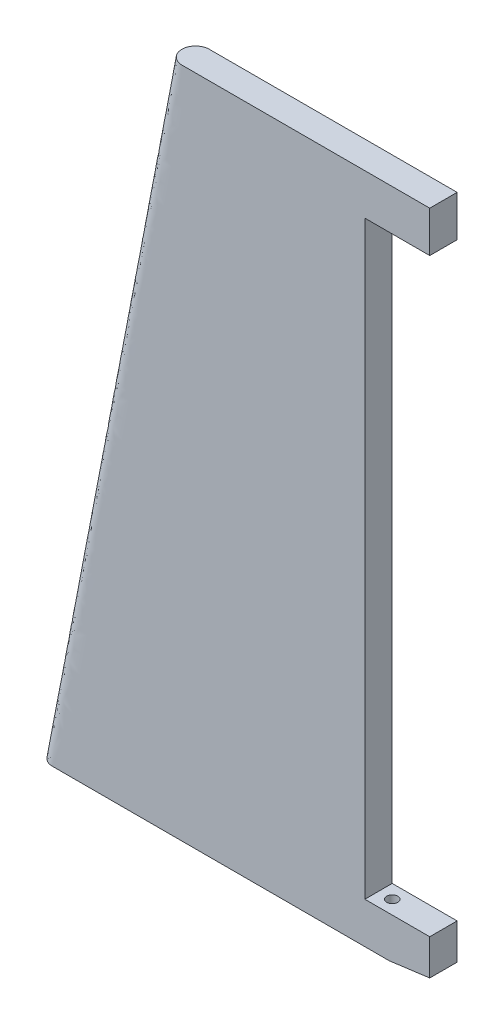
ISO-10303-21;
HEADER;
FILE_DESCRIPTION(('STEP AP214'),'2;1');
FILE_NAME('part.step','',(''),(''),'','','');
FILE_SCHEMA(('AUTOMOTIVE_DESIGN { 1 0 10303 214 1 1 1 1 }'));
ENDSEC;
DATA;
#1=APPLICATION_CONTEXT('core data for automotive mechanical design processes');
#2=APPLICATION_PROTOCOL_DEFINITION('international standard','automotive_design',2000,#1);
#3=PRODUCT_CONTEXT('',#1,'mechanical');
#4=PRODUCT('Part','Part','',(#3));
#5=PRODUCT_RELATED_PRODUCT_CATEGORY('part','',(#4));
#6=PRODUCT_DEFINITION_FORMATION('','',#4);
#7=PRODUCT_DEFINITION_CONTEXT('part definition',#1,'design');
#8=PRODUCT_DEFINITION('design','',#6,#7);
#9=PRODUCT_DEFINITION_SHAPE('','',#8);
#10=(LENGTH_UNIT() NAMED_UNIT(*) SI_UNIT(.MILLI.,.METRE.));
#11=(NAMED_UNIT(*) PLANE_ANGLE_UNIT() SI_UNIT($,.RADIAN.));
#12=(NAMED_UNIT(*) SI_UNIT($,.STERADIAN.) SOLID_ANGLE_UNIT());
#13=UNCERTAINTY_MEASURE_WITH_UNIT(LENGTH_MEASURE(1.E-05),#10,'distance_accuracy_value','');
#14=(GEOMETRIC_REPRESENTATION_CONTEXT(3) GLOBAL_UNCERTAINTY_ASSIGNED_CONTEXT((#13)) GLOBAL_UNIT_ASSIGNED_CONTEXT((#10,
#11,#12)) REPRESENTATION_CONTEXT('',''));
#15=CARTESIAN_POINT('',(0.,0.,0.));
#16=DIRECTION('',(0.,0.,1.));
#17=DIRECTION('',(1.,0.,0.));
#18=AXIS2_PLACEMENT_3D('',#15,#16,#17);
#19=CARTESIAN_POINT('',(47.7500000000001,0.,-5.));
#20=DIRECTION('',(1.,0.,0.));
#21=DIRECTION('',(0.,0.,1.));
#22=AXIS2_PLACEMENT_3D('',#19,#20,#21);
#23=PLANE('',#22);
#24=DIRECTION('',(0.,0.,1.));
#25=VECTOR('',#24,1.);
#26=CARTESIAN_POINT('',(47.7500000000001,-243.455236243208,-5.01117192027193));
#27=LINE('',#26,#25);
#28=CARTESIAN_POINT('',(47.7500000000001,-243.455236243208,-5.));
#29=VERTEX_POINT('',#28);
#30=CARTESIAN_POINT('',(47.7500000000001,-243.455236243208,5.));
#31=VERTEX_POINT('',#30);
#32=EDGE_CURVE('E233',#29,#31,#27,.T.);
#33=ORIENTED_EDGE('',*,*,#32,.F.);
#34=CARTESIAN_POINT('',(47.7500000000001,0.,-5.));
#35=CARTESIAN_POINT('',(47.7500000000001,-81.8,-5.));
#36=CARTESIAN_POINT('',(47.7500000000001,-163.6,-5.));
#37=CARTESIAN_POINT('',(47.7500000000001,-245.4,-5.));
#38=B_SPLINE_CURVE_WITH_KNOTS('',3,(#34,#35,#36,#37),.UNSPECIFIED.,.F.,.F.,(4,4),(0.,1.),.UNSPECIFIED.);
#39=CARTESIAN_POINT('',(47.7500000000001,-230.4,-5.));
#40=VERTEX_POINT('',#39);
#41=EDGE_CURVE('E231',#40,#29,#38,.T.);
#42=ORIENTED_EDGE('',*,*,#41,.F.);
#43=DIRECTION('',(0.,0.,1.));
#44=VECTOR('',#43,1.);
#45=CARTESIAN_POINT('',(47.7500000000001,-230.4,-5.));
#46=LINE('',#45,#44);
#47=CARTESIAN_POINT('',(47.7500000000001,-230.4,5.));
#48=VERTEX_POINT('',#47);
#49=EDGE_CURVE('E401',#40,#48,#46,.T.);
#50=ORIENTED_EDGE('',*,*,#49,.T.);
#51=CARTESIAN_POINT('',(47.7500000000001,0.,5.));
#52=CARTESIAN_POINT('',(47.7500000000001,-81.8,5.));
#53=CARTESIAN_POINT('',(47.7500000000001,-163.6,5.));
#54=CARTESIAN_POINT('',(47.7500000000001,-245.4,5.));
#55=B_SPLINE_CURVE_WITH_KNOTS('',3,(#51,#52,#53,#54),.UNSPECIFIED.,.F.,.F.,(4,4),(0.,1.),.UNSPECIFIED.);
#56=EDGE_CURVE('E280',#48,#31,#55,.T.);
#57=ORIENTED_EDGE('',*,*,#56,.T.);
#58=EDGE_LOOP('',(#33,#42,#50,#57));
#59=FACE_BOUND('',#58,.T.);
#60=ADVANCED_FACE('F145',(#59),#23,.T.);
#61=CARTESIAN_POINT('',(47.7500000000001,0.,5.));
#62=CARTESIAN_POINT('',(47.7500000000001,-81.8,5.));
#63=CARTESIAN_POINT('',(47.7500000000001,-163.6,5.));
#64=CARTESIAN_POINT('',(47.7500000000001,-245.4,5.));
#65=CARTESIAN_POINT('',(40.1384970719996,0.,5.));
#66=CARTESIAN_POINT('',(38.8831968508896,-81.8,5.));
#67=CARTESIAN_POINT('',(37.6278966297795,-163.6,5.));
#68=CARTESIAN_POINT('',(36.3725964086695,-245.4,5.));
#69=CARTESIAN_POINT('',(25.0855050019117,0.,4.99999999999999));
#70=CARTESIAN_POINT('',(21.1802092151754,-81.8,5.));
#71=CARTESIAN_POINT('',(17.2749134284391,-163.6,5.));
#72=CARTESIAN_POINT('',(13.3696176417028,-245.4,5.00000000000001));
#73=CARTESIAN_POINT('',(2.7025934943437,0.,5.00000000000001));
#74=CARTESIAN_POINT('',(-5.34827559688911,-81.8,5.00000000000001));
#75=CARTESIAN_POINT('',(-13.3991446881219,-163.6,5.00000000000001));
#76=CARTESIAN_POINT('',(-21.4500137793547,-245.4,5.));
#77=CARTESIAN_POINT('',(-19.7693718356554,0.,4.99999999999999));
#78=CARTESIAN_POINT('',(-31.8835262879781,-81.8,5.));
#79=CARTESIAN_POINT('',(-43.9976807403008,-163.6,5.00000000000001));
#80=CARTESIAN_POINT('',(-56.1118351926235,-245.4,5.00000000000002));
#81=CARTESIAN_POINT('',(-35.0076650751698,0.,5.));
#82=CARTESIAN_POINT('',(-49.6095235299032,-81.8,5.00000000000001));
#83=CARTESIAN_POINT('',(-64.2113819846367,-163.6,5.00000000000001));
#84=CARTESIAN_POINT('',(-78.8132404393702,-245.4,5.00000000000002));
#85=CARTESIAN_POINT('',(-43.3041643359938,0.,5.));
#86=CARTESIAN_POINT('',(-59.1363435627048,-81.8,5.00000000000001));
#87=CARTESIAN_POINT('',(-74.9685227894158,-163.6,5.00000000000001));
#88=CARTESIAN_POINT('',(-90.8007020161267,-245.4,5.00000000000002));
#89=CARTESIAN_POINT('',(-44.4696180344247,0.,4.81469804673856));
#90=CARTESIAN_POINT('',(-60.3919930415603,-81.8,4.7521639429831));
#91=CARTESIAN_POINT('',(-76.3143680486958,-163.6,4.68962983922764));
#92=CARTESIAN_POINT('',(-92.2367430558314,-245.4,4.62709573547219));
#93=CARTESIAN_POINT('',(-46.1576872101183,0.,3.84083819439326));
#94=CARTESIAN_POINT('',(-62.0445856350291,-81.8,3.69796872118903));
#95=CARTESIAN_POINT('',(-77.93148405994,-163.6,3.55509924798481));
#96=CARTESIAN_POINT('',(-93.8183824848508,-245.4,3.41222977478059));
#97=CARTESIAN_POINT('',(-47.4298538886044,0.,2.15752729076791));
#98=CARTESIAN_POINT('',(-63.2145079084293,-81.7999999999999,2.03802124784213));
#99=CARTESIAN_POINT('',(-78.9991619282543,-163.6,1.91851520491636));
#100=CARTESIAN_POINT('',(-94.7838159480792,-245.4,1.79900916199058));
#101=CARTESIAN_POINT('',(-47.9109803865005,0.,0.));
#102=CARTESIAN_POINT('',(-63.6433562095258,-81.8000000000001,0.));
#103=CARTESIAN_POINT('',(-79.3757320325512,-163.6,0.));
#104=CARTESIAN_POINT('',(-95.1081078555765,-245.4,0.));
#105=CARTESIAN_POINT('',(-47.4298538886045,0.,-2.15752729076794));
#106=CARTESIAN_POINT('',(-63.2145079084294,-81.7999999999999,-2.03802124784215));
#107=CARTESIAN_POINT('',(-78.9991619282544,-163.6,-1.91851520491635));
#108=CARTESIAN_POINT('',(-94.7838159480794,-245.4,-1.79900916199056));
#109=CARTESIAN_POINT('',(-46.1576872101182,0.,-3.84083819439327));
#110=CARTESIAN_POINT('',(-62.0445856350291,-81.7999999999999,-3.69796872118903));
#111=CARTESIAN_POINT('',(-77.9314840599399,-163.6,-3.5550992479848));
#112=CARTESIAN_POINT('',(-93.8183824848508,-245.4,-3.41222977478056));
#113=CARTESIAN_POINT('',(-44.4696180344248,0.,-4.81469804673857));
#114=CARTESIAN_POINT('',(-60.3919930415603,-81.8000000000001,-4.75216394298311));
#115=CARTESIAN_POINT('',(-76.3143680486959,-163.6,-4.68962983922764));
#116=CARTESIAN_POINT('',(-92.2367430558314,-245.4,-4.62709573547218));
#117=CARTESIAN_POINT('',(-43.3041643359938,0.,-5.));
#118=CARTESIAN_POINT('',(-59.1363435627048,-81.8,-5.00000000000001));
#119=CARTESIAN_POINT('',(-74.9685227894158,-163.6,-5.00000000000002));
#120=CARTESIAN_POINT('',(-90.8007020161267,-245.4,-5.00000000000002));
#121=CARTESIAN_POINT('',(-35.0076650751697,0.,-5.));
#122=CARTESIAN_POINT('',(-49.6095235299032,-81.8,-5.00000000000001));
#123=CARTESIAN_POINT('',(-64.2113819846367,-163.6,-5.00000000000001));
#124=CARTESIAN_POINT('',(-78.8132404393702,-245.4,-5.00000000000002));
#125=CARTESIAN_POINT('',(-19.7693718356554,0.,-5.));
#126=CARTESIAN_POINT('',(-31.8835262879781,-81.8,-5.00000000000001));
#127=CARTESIAN_POINT('',(-43.9976807403008,-163.6,-5.00000000000001));
#128=CARTESIAN_POINT('',(-56.1118351926235,-245.4,-5.00000000000002));
#129=CARTESIAN_POINT('',(2.70259349434367,0.,-5.));
#130=CARTESIAN_POINT('',(-5.34827559688914,-81.8,-5.));
#131=CARTESIAN_POINT('',(-13.399144688122,-163.6,-5.));
#132=CARTESIAN_POINT('',(-21.4500137793548,-245.4,-5.));
#133=CARTESIAN_POINT('',(25.0855050019117,0.,-5.));
#134=CARTESIAN_POINT('',(21.1802092151754,-81.8,-5.00000000000001));
#135=CARTESIAN_POINT('',(17.2749134284391,-163.6,-5.00000000000001));
#136=CARTESIAN_POINT('',(13.3696176417028,-245.4,-5.00000000000001));
#137=CARTESIAN_POINT('',(40.1384970719996,0.,-5.));
#138=CARTESIAN_POINT('',(38.8831968508896,-81.8,-5.));
#139=CARTESIAN_POINT('',(37.6278966297795,-163.6,-5.));
#140=CARTESIAN_POINT('',(36.3725964086695,-245.4,-5.));
#141=CARTESIAN_POINT('',(47.7500000000001,0.,-5.));
#142=CARTESIAN_POINT('',(47.7500000000001,-81.8,-5.));
#143=CARTESIAN_POINT('',(47.7500000000001,-163.6,-5.));
#144=CARTESIAN_POINT('',(47.7500000000001,-245.4,-5.));
#145=B_SPLINE_SURFACE_WITH_KNOTS('',3,3,((#61,#62,#63,#64),(#65,#66,#67,#68),(#69,#70,#71,#72),
(#73,#74,#75,#76),(#77,#78,#79,#80),(#81,#82,#83,#84),(#85,#86,#87,#88),(#89,#90,#91,#92),(#93,
#94,#95,#96),(#97,#98,#99,#100),(#101,#102,#103,#104),(#105,#106,#107,#108),(#109,#110,#111,
#112),(#113,#114,#115,#116),(#117,#118,#119,#120),(#121,#122,#123,#124),(#125,#126,#127,#128),
(#129,#130,#131,#132),(#133,#134,#135,#136),(#137,#138,#139,#140),(#141,#142,#143,#144)),
.UNSPECIFIED.,.F.,.F.,.F.,(4,1,1,1,2,1,1,1,1,1,1,1,2,1,1,1,4),(4,4),(0.,0.111892620861308,
0.223785241722616,0.335677862583924,0.447570483445232,0.455579294874738,0.463588106304243,
0.471596917733748,0.479605729163254,0.487614540592759,0.495623352022264,0.50363216345177,
0.511640974881275,0.623533595742583,0.735426216603891,0.8473188374652,0.959211458326508),(0.,
1.),.UNSPECIFIED.);
#146=CARTESIAN_POINT('',(32.9776132120934,-245.4,-5.));
#147=CARTESIAN_POINT('',(33.763942429076,-245.30236125408,-5.00000000000001));
#148=CARTESIAN_POINT('',(34.5501656883627,-245.203867179065,-5.00000000000001));
#149=CARTESIAN_POINT('',(36.1223871469882,-245.005092485096,-5.));
#150=CARTESIAN_POINT('',(36.9083853460892,-244.904811864262,-5.));
#151=CARTESIAN_POINT('',(38.4801269836612,-244.702390317166,-5.));
#152=CARTESIAN_POINT('',(39.26587042668,-244.600249426212,-5.));
#153=CARTESIAN_POINT('',(40.8371176881815,-244.39414263567,-5.));
#154=CARTESIAN_POINT('',(41.6226215068033,-244.290176737144,-5.));
#155=CARTESIAN_POINT('',(42.8533197615781,-244.125582369708,-5.));
#156=CARTESIAN_POINT('',(43.2986112416995,-244.065679002316,-5.));
#157=CARTESIAN_POINT('',(44.1891135863673,-243.945276428653,-5.));
#158=CARTESIAN_POINT('',(44.6343244509202,-243.884777222431,-5.));
#159=CARTESIAN_POINT('',(45.3020856429461,-243.793607062374,-5.));
#160=CARTESIAN_POINT('',(45.5246647278354,-243.76314661783,-5.));
#161=CARTESIAN_POINT('',(45.9697972407908,-243.702038737449,-5.));
#162=CARTESIAN_POINT('',(46.1923506688573,-243.671391301614,-5.));
#163=CARTESIAN_POINT('',(46.6374302297465,-243.60989900007,-5.));
#164=CARTESIAN_POINT('',(46.8599563625694,-243.579054134363,-5.));
#165=CARTESIAN_POINT('',(47.3049899974827,-243.517230116495,-5.));
#166=CARTESIAN_POINT('',(47.5274974995717,-243.486250964324,-5.));
#167=CARTESIAN_POINT('',(47.7500000000001,-243.455236243208,-5.));
#168=B_SPLINE_CURVE_WITH_KNOTS('',3,(#146,#147,#148,#149,#150,#151,#152,#153,#154,#155,#156,
#157,#158,#159,#160,#161,#162,#163,#164,#165,#166,#167),.UNSPECIFIED.,.F.,.F.,(4,2,2,2,2,2,2,2,
2,2,4),(0.,2.37710376388623,4.75421003005931,7.13127122527766,9.50833103824361,10.85623869206,
12.2041462379778,12.8781073093574,13.5520683669784,14.2260294183358,14.8999905227429),.UNSPECIFIED.);
#169=CARTESIAN_POINT('',(32.9776132120937,-245.4,-5.));
#170=VERTEX_POINT('',#169);
#171=EDGE_CURVE('E218',#170,#29,#168,.T.);
#172=DIRECTION('',(-1.,0.,0.));
#173=VECTOR('',#172,1.);
#174=CARTESIAN_POINT('',(47.7500000000001,-245.4,-5.));
#175=LINE('',#174,#173);
#176=CARTESIAN_POINT('',(-90.,-245.4,-5.00000000000002));
#177=VERTEX_POINT('',#176);
#178=EDGE_CURVE('E150',#170,#177,#175,.T.);
#179=CARTESIAN_POINT('',(-90.,-245.4,0.));
#180=DIRECTION('',(0.,1.,0.));
#181=DIRECTION('',(0.,0.,1.));
#182=AXIS2_PLACEMENT_3D('',#179,#180,#181);
#183=CIRCLE('',#182,5.00000000000002);
#184=CARTESIAN_POINT('',(-89.9999999999253,-245.4,5.00000000000002));
#185=VERTEX_POINT('',#184);
#186=EDGE_CURVE('E237',#177,#185,#183,.T.);
#187=DIRECTION('',(1.,0.,0.));
#188=VECTOR('',#187,1.);
#189=CARTESIAN_POINT('',(47.7500000000001,-245.4,5.));
#190=LINE('',#189,#188);
#191=CARTESIAN_POINT('',(32.9776132120938,-245.4,5.));
#192=VERTEX_POINT('',#191);
#193=EDGE_CURVE('E273',#185,#192,#190,.T.);
#194=CARTESIAN_POINT('',(47.7500000000001,-243.455236243208,5.));
#195=CARTESIAN_POINT('',(47.553804426979,-243.482584950988,5.));
#196=CARTESIAN_POINT('',(47.3576048714236,-243.509905256416,5.));
#197=CARTESIAN_POINT('',(46.9651919274039,-243.564446384229,5.));
#198=CARTESIAN_POINT('',(46.7689785389391,-243.591667206609,5.));
#199=CARTESIAN_POINT('',(46.3765320800134,-243.645966687366,5.));
#200=CARTESIAN_POINT('',(46.1802990095527,-243.673045345742,5.));
#201=CARTESIAN_POINT('',(45.787811456779,-243.727046944515,5.));
#202=CARTESIAN_POINT('',(45.5915569744668,-243.753969884917,5.));
#203=CARTESIAN_POINT('',(45.0027685326783,-243.834555170022,5.));
#204=CARTESIAN_POINT('',(44.6102094555691,-243.888033995587,5.));
#205=CARTESIAN_POINT('',(43.8250340818926,-243.994569971546,5.));
#206=CARTESIAN_POINT('',(43.4324177853248,-244.047627121936,5.));
#207=CARTESIAN_POINT('',(42.6471216773976,-244.153216009346,5.));
#208=CARTESIAN_POINT('',(42.2544418673041,-244.205747755775,5.));
#209=CARTESIAN_POINT('',(41.4690133927459,-244.310293580927,5.));
#210=CARTESIAN_POINT('',(41.076264728282,-244.362307659655,5.));
#211=CARTESIAN_POINT('',(39.8979266543067,-244.517650019364,5.));
#212=CARTESIAN_POINT('',(39.1122448807419,-244.620278461925,5.));
#213=CARTESIAN_POINT('',(37.4352741623308,-244.837317708853,5.));
#214=CARTESIAN_POINT('',(36.5439508807239,-244.951463157056,5.));
#215=CARTESIAN_POINT('',(34.7610023130234,-245.177444957387,5.));
#216=CARTESIAN_POINT('',(33.8693770239223,-245.289281285789,5.));
#217=CARTESIAN_POINT('',(32.9776132120943,-245.4,5.));
#218=B_SPLINE_CURVE_WITH_KNOTS('',3,(#194,#195,#196,#197,#198,#199,#200,#201,#202,#203,#204,
#205,#206,#207,#208,#209,#210,#211,#212,#213,#214,#215,#216,#217),.UNSPECIFIED.,.F.,.F.,(4,2,2,
2,2,2,2,2,2,2,2,4),(0.,0.594277656406833,1.18855534111411,1.78283302561652,2.3771106906352,
3.56566564883137,4.75422061863467,5.94275426424822,7.13128789662687,9.50835430334834,
12.2041586019832,14.8999905858322),.UNSPECIFIED.);
#219=EDGE_CURVE('E163',#31,#192,#218,.T.);
#220=DIRECTION('',(1.,0.,0.));
#221=VECTOR('',#220,1.);
#222=CARTESIAN_POINT('',(47.7500000000001,-230.4,5.));
#223=LINE('',#222,#221);
#224=CARTESIAN_POINT('',(24.0500000000001,-230.4,5.));
#225=VERTEX_POINT('',#224);
#226=EDGE_CURVE('E410',#225,#48,#223,.T.);
#227=DIRECTION('',(0.,-1.,0.));
#228=VECTOR('',#227,1.);
#229=CARTESIAN_POINT('',(24.0500000000001,-15.,5.));
#230=LINE('',#229,#228);
#231=CARTESIAN_POINT('',(24.0500000000001,-15.,5.));
#232=VERTEX_POINT('',#231);
#233=EDGE_CURVE('E419',#232,#225,#230,.T.);
#234=DIRECTION('',(-1.,0.,0.));
#235=VECTOR('',#234,1.);
#236=CARTESIAN_POINT('',(47.7500000000001,-15.,5.));
#237=LINE('',#236,#235);
#238=CARTESIAN_POINT('',(47.7500000000001,-15.,5.));
#239=VERTEX_POINT('',#238);
#240=EDGE_CURVE('E416',#239,#232,#237,.T.);
#241=CARTESIAN_POINT('',(47.7500000000001,0.,5.));
#242=VERTEX_POINT('',#241);
#243=EDGE_CURVE('E276',#242,#239,#55,.T.);
#244=DIRECTION('',(1.,0.,0.));
#245=VECTOR('',#244,1.);
#246=CARTESIAN_POINT('',(-42.7499999999999,0.,5.));
#247=LINE('',#246,#245);
#248=CARTESIAN_POINT('',(-42.7499999999999,0.,5.));
#249=VERTEX_POINT('',#248);
#250=EDGE_CURVE('E304',#249,#242,#247,.T.);
#251=CARTESIAN_POINT('',(-42.7499999999999,0.,0.));
#252=DIRECTION('',(0.,1.,0.));
#253=DIRECTION('',(0.,0.,1.));
#254=AXIS2_PLACEMENT_3D('',#251,#252,#253);
#255=CIRCLE('',#254,5.);
#256=CARTESIAN_POINT('',(-42.7499999992681,0.,-5.));
#257=VERTEX_POINT('',#256);
#258=EDGE_CURVE('E349',#257,#249,#255,.T.);
#259=DIRECTION('',(-1.,0.,0.));
#260=VECTOR('',#259,1.);
#261=CARTESIAN_POINT('',(-42.7499999999999,0.,-5.));
#262=LINE('',#261,#260);
#263=CARTESIAN_POINT('',(47.7500000000001,0.,-5.));
#264=VERTEX_POINT('',#263);
#265=EDGE_CURVE('E382',#264,#257,#262,.T.);
#266=CARTESIAN_POINT('',(47.7500000000001,-15.,-5.));
#267=VERTEX_POINT('',#266);
#268=EDGE_CURVE('E286',#264,#267,#38,.T.);
#269=DIRECTION('',(-1.,0.,0.));
#270=VECTOR('',#269,1.);
#271=CARTESIAN_POINT('',(47.7500000000001,-15.,-5.));
#272=LINE('',#271,#270);
#273=CARTESIAN_POINT('',(24.0500000000001,-15.,-5.));
#274=VERTEX_POINT('',#273);
#275=EDGE_CURVE('E430',#267,#274,#272,.T.);
#276=DIRECTION('',(0.,-1.,0.));
#277=VECTOR('',#276,1.);
#278=CARTESIAN_POINT('',(24.0500000000001,-15.,-5.));
#279=LINE('',#278,#277);
#280=CARTESIAN_POINT('',(24.0500000000001,-230.4,-5.));
#281=VERTEX_POINT('',#280);
#282=EDGE_CURVE('E427',#274,#281,#279,.T.);
#283=DIRECTION('',(1.,0.,0.));
#284=VECTOR('',#283,1.);
#285=CARTESIAN_POINT('',(47.7500000000001,-230.4,-5.));
#286=LINE('',#285,#284);
#287=EDGE_CURVE('E414',#281,#40,#286,.T.);
#288=ORIENTED_EDGE('',*,*,#171,.F.);
#289=ORIENTED_EDGE('',*,*,#178,.T.);
#290=ORIENTED_EDGE('',*,*,#186,.T.);
#291=ORIENTED_EDGE('',*,*,#193,.T.);
#292=ORIENTED_EDGE('',*,*,#219,.F.);
#293=ORIENTED_EDGE('',*,*,#56,.F.);
#294=ORIENTED_EDGE('',*,*,#226,.F.);
#295=ORIENTED_EDGE('',*,*,#233,.F.);
#296=ORIENTED_EDGE('',*,*,#240,.F.);
#297=ORIENTED_EDGE('',*,*,#243,.F.);
#298=ORIENTED_EDGE('',*,*,#250,.F.);
#299=ORIENTED_EDGE('',*,*,#258,.F.);
#300=ORIENTED_EDGE('',*,*,#265,.F.);
#301=ORIENTED_EDGE('',*,*,#268,.T.);
#302=ORIENTED_EDGE('',*,*,#275,.T.);
#303=ORIENTED_EDGE('',*,*,#282,.T.);
#304=ORIENTED_EDGE('',*,*,#287,.T.);
#305=ORIENTED_EDGE('',*,*,#41,.T.);
#306=EDGE_LOOP('',(#288,#289,#290,#291,#292,#293,#294,#295,#296,#297,#298,#299,#300,#301,#302,
#303,#304,#305));
#307=FACE_BOUND('',#306,.T.);
#308=ADVANCED_FACE('F226',(#307),#145,.T.);
#309=CARTESIAN_POINT('',(-90.,-245.4,0.));
#310=DIRECTION('',(0.,1.,0.));
#311=DIRECTION('',(0.,0.,1.));
#312=AXIS2_PLACEMENT_3D('',#309,#310,#311);
#313=PLANE('',#312);
#314=ORIENTED_EDGE('',*,*,#178,.F.);
#315=DIRECTION('',(0.,0.,1.));
#316=VECTOR('',#315,1.);
#317=CARTESIAN_POINT('',(32.9776132120938,-245.4,-5.01117192027194));
#318=LINE('',#317,#316);
#319=EDGE_CURVE('E13',#170,#192,#318,.T.);
#320=ORIENTED_EDGE('',*,*,#319,.T.);
#321=ORIENTED_EDGE('',*,*,#193,.F.);
#322=ORIENTED_EDGE('',*,*,#186,.F.);
#323=EDGE_LOOP('',(#314,#320,#321,#322));
#324=FACE_BOUND('',#323,.T.);
#325=ADVANCED_FACE('F236',(#324),#313,.F.);
#326=CARTESIAN_POINT('',(-42.7499999999999,0.,0.));
#327=DIRECTION('',(0.,1.,0.));
#328=DIRECTION('',(0.,0.,1.));
#329=AXIS2_PLACEMENT_3D('',#326,#327,#328);
#330=PLANE('',#329);
#331=DIRECTION('',(0.,0.,-1.));
#332=VECTOR('',#331,1.);
#333=CARTESIAN_POINT('',(47.7500000000001,0.,5.));
#334=LINE('',#333,#332);
#335=EDGE_CURVE('E389',#242,#264,#334,.T.);
#336=ORIENTED_EDGE('',*,*,#335,.T.);
#337=ORIENTED_EDGE('',*,*,#265,.T.);
#338=ORIENTED_EDGE('',*,*,#258,.T.);
#339=ORIENTED_EDGE('',*,*,#250,.T.);
#340=EDGE_LOOP('',(#336,#337,#338,#339));
#341=FACE_BOUND('',#340,.T.);
#342=ADVANCED_FACE('F256',(#341),#330,.T.);
#343=DIRECTION('',(0.,0.,1.));
#344=VECTOR('',#343,1.);
#345=CARTESIAN_POINT('',(47.7500000000001,-15.,-5.));
#346=LINE('',#345,#344);
#347=EDGE_CURVE('E170',#267,#239,#346,.T.);
#348=ORIENTED_EDGE('',*,*,#347,.F.);
#349=ORIENTED_EDGE('',*,*,#268,.F.);
#350=ORIENTED_EDGE('',*,*,#335,.F.);
#351=ORIENTED_EDGE('',*,*,#243,.T.);
#352=EDGE_LOOP('',(#348,#349,#350,#351));
#353=FACE_BOUND('',#352,.T.);
#354=ADVANCED_FACE('F147',(#353),#23,.T.);
#355=CARTESIAN_POINT('',(47.7500000000001,-230.4,-5.));
#356=DIRECTION('',(0.,-1.,0.));
#357=DIRECTION('',(0.,0.,-1.));
#358=AXIS2_PLACEMENT_3D('',#355,#356,#357);
#359=PLANE('',#358);
#360=CARTESIAN_POINT('',(29.0500000000001,-230.4,0.));
#361=DIRECTION('',(0.,1.,0.));
#362=DIRECTION('',(0.,0.,1.));
#363=AXIS2_PLACEMENT_3D('',#360,#361,#362);
#364=CIRCLE('',#363,2.);
#365=CARTESIAN_POINT('',(29.0500000000001,-230.4,2.));
#366=VERTEX_POINT('',#365);
#367=EDGE_CURVE('E423',#366,#366,#364,.T.);
#368=ORIENTED_EDGE('',*,*,#367,.F.);
#369=EDGE_LOOP('',(#368));
#370=FACE_BOUND('',#369,.T.);
#371=ORIENTED_EDGE('',*,*,#226,.T.);
#372=ORIENTED_EDGE('',*,*,#49,.F.);
#373=ORIENTED_EDGE('',*,*,#287,.F.);
#374=DIRECTION('',(0.,0.,1.));
#375=VECTOR('',#374,1.);
#376=CARTESIAN_POINT('',(24.0500000000001,-230.4,-5.));
#377=LINE('',#376,#375);
#378=EDGE_CURVE('E403',#281,#225,#377,.T.);
#379=ORIENTED_EDGE('',*,*,#378,.T.);
#380=EDGE_LOOP('',(#371,#372,#373,#379));
#381=FACE_BOUND('',#380,.T.);
#382=ADVANCED_FACE('F473',(#370,#381),#359,.F.);
#383=CARTESIAN_POINT('',(24.0500000000001,-15.,-5.));
#384=DIRECTION('',(-1.,0.,0.));
#385=DIRECTION('',(0.,-1.,0.));
#386=AXIS2_PLACEMENT_3D('',#383,#384,#385);
#387=PLANE('',#386);
#388=ORIENTED_EDGE('',*,*,#233,.T.);
#389=ORIENTED_EDGE('',*,*,#378,.F.);
#390=ORIENTED_EDGE('',*,*,#282,.F.);
#391=DIRECTION('',(0.,0.,1.));
#392=VECTOR('',#391,1.);
#393=CARTESIAN_POINT('',(24.0500000000001,-15.,-5.));
#394=LINE('',#393,#392);
#395=EDGE_CURVE('E407',#274,#232,#394,.T.);
#396=ORIENTED_EDGE('',*,*,#395,.T.);
#397=EDGE_LOOP('',(#388,#389,#390,#396));
#398=FACE_BOUND('',#397,.T.);
#399=ADVANCED_FACE('F477',(#398),#387,.F.);
#400=CARTESIAN_POINT('',(47.7500000000001,-15.,-5.));
#401=DIRECTION('',(0.,1.,0.));
#402=DIRECTION('',(-1.,0.,0.));
#403=AXIS2_PLACEMENT_3D('',#400,#401,#402);
#404=PLANE('',#403);
#405=CARTESIAN_POINT('',(29.0500000000001,-15.,0.));
#406=DIRECTION('',(0.,1.,0.));
#407=DIRECTION('',(0.,0.,1.));
#408=AXIS2_PLACEMENT_3D('',#405,#406,#407);
#409=CIRCLE('',#408,2.);
#410=CARTESIAN_POINT('',(29.0500000000001,-15.,2.));
#411=VERTEX_POINT('',#410);
#412=EDGE_CURVE('E232',#411,#411,#409,.T.);
#413=ORIENTED_EDGE('',*,*,#412,.T.);
#414=EDGE_LOOP('',(#413));
#415=FACE_BOUND('',#414,.T.);
#416=ORIENTED_EDGE('',*,*,#240,.T.);
#417=ORIENTED_EDGE('',*,*,#395,.F.);
#418=ORIENTED_EDGE('',*,*,#275,.F.);
#419=ORIENTED_EDGE('',*,*,#347,.T.);
#420=EDGE_LOOP('',(#416,#417,#418,#419));
#421=FACE_BOUND('',#420,.T.);
#422=ADVANCED_FACE('F368',(#415,#421),#404,.F.);
#423=CARTESIAN_POINT('',(29.0500000000001,-240.4,0.));
#424=DIRECTION('',(0.,1.,0.));
#425=DIRECTION('',(0.,0.,1.));
#426=AXIS2_PLACEMENT_3D('',#423,#424,#425);
#427=CYLINDRICAL_SURFACE('',#426,2.);
#428=CARTESIAN_POINT('',(29.0500000000001,-240.4,0.));
#429=DIRECTION('',(0.,1.,0.));
#430=DIRECTION('',(0.,0.,1.));
#431=AXIS2_PLACEMENT_3D('',#428,#429,#430);
#432=CIRCLE('',#431,2.);
#433=CARTESIAN_POINT('',(29.0500000000001,-240.4,2.));
#434=VERTEX_POINT('',#433);
#435=EDGE_CURVE('E420',#434,#434,#432,.T.);
#436=ORIENTED_EDGE('',*,*,#435,.F.);
#437=EDGE_LOOP('',(#436));
#438=FACE_BOUND('',#437,.T.);
#439=ORIENTED_EDGE('',*,*,#367,.T.);
#440=EDGE_LOOP('',(#439));
#441=FACE_BOUND('',#440,.T.);
#442=ADVANCED_FACE('F504',(#438,#441),#427,.F.);
#443=CARTESIAN_POINT('',(29.0500000000001,-240.4,0.));
#444=DIRECTION('',(0.,1.,0.));
#445=DIRECTION('',(0.,0.,1.));
#446=AXIS2_PLACEMENT_3D('',#443,#444,#445);
#447=PLANE('',#446);
#448=ORIENTED_EDGE('',*,*,#435,.T.);
#449=EDGE_LOOP('',(#448));
#450=FACE_BOUND('',#449,.T.);
#451=ADVANCED_FACE('F509',(#450),#447,.T.);
#452=CARTESIAN_POINT('',(29.0500000000001,-5.00000000000001,0.));
#453=DIRECTION('',(0.,-1.,0.));
#454=DIRECTION('',(0.,0.,-1.));
#455=AXIS2_PLACEMENT_3D('',#452,#453,#454);
#456=CYLINDRICAL_SURFACE('',#455,2.);
#457=CARTESIAN_POINT('',(29.0500000000001,-5.00000000000001,0.));
#458=DIRECTION('',(0.,1.,0.));
#459=DIRECTION('',(0.,0.,1.));
#460=AXIS2_PLACEMENT_3D('',#457,#458,#459);
#461=CIRCLE('',#460,2.);
#462=CARTESIAN_POINT('',(29.0500000000001,-5.00000000000001,2.));
#463=VERTEX_POINT('',#462);
#464=EDGE_CURVE('E434',#463,#463,#461,.T.);
#465=ORIENTED_EDGE('',*,*,#464,.T.);
#466=EDGE_LOOP('',(#465));
#467=FACE_BOUND('',#466,.T.);
#468=ORIENTED_EDGE('',*,*,#412,.F.);
#469=EDGE_LOOP('',(#468));
#470=FACE_BOUND('',#469,.T.);
#471=ADVANCED_FACE('F512',(#467,#470),#456,.F.);
#472=CARTESIAN_POINT('',(29.0500000000001,-5.00000000000001,0.));
#473=DIRECTION('',(0.,-1.,0.));
#474=DIRECTION('',(0.,0.,1.));
#475=AXIS2_PLACEMENT_3D('',#472,#473,#474);
#476=PLANE('',#475);
#477=ORIENTED_EDGE('',*,*,#464,.F.);
#478=EDGE_LOOP('',(#477));
#479=FACE_BOUND('',#478,.T.);
#480=ADVANCED_FACE('F451',(#479),#476,.T.);
#481=CARTESIAN_POINT('',(48.3579684105031,-243.370181489619,-5.01117192027193));
#482=CARTESIAN_POINT('',(48.2809191341135,-243.380986661303,-5.01117192027193));
#483=CARTESIAN_POINT('',(47.9731417675263,-243.424148485038,-5.01117192027193));
#484=CARTESIAN_POINT('',(47.2824192521413,-243.520447018342,-5.01117192027193));
#485=CARTESIAN_POINT('',(46.1359829717308,-243.679575239239,-5.01117192027193));
#486=CARTESIAN_POINT('',(44.540838201102,-243.897897506095,-5.01117192027193));
#487=CARTESIAN_POINT('',(42.5068966272035,-244.17290593525,-5.01117192027193));
#488=CARTESIAN_POINT('',(40.0465924295419,-244.499044731414,-5.01117192027193));
#489=CARTESIAN_POINT('',(37.1751209028632,-244.87192738393,-5.01117192027193));
#490=CARTESIAN_POINT('',(33.9102261172361,-245.285689510097,-5.01117192027193));
#491=CARTESIAN_POINT('',(30.2720007239264,-245.734775853982,-5.01117192027193));
#492=CARTESIAN_POINT('',(26.2828803014121,-246.21256595568,-5.01117192027193));
#493=CARTESIAN_POINT('',(21.967485582398,-246.713303025597,-5.01117192027193));
#494=CARTESIAN_POINT('',(17.3523601554547,-247.230118083653,-5.01117192027193));
#495=CARTESIAN_POINT('',(12.4659831663073,-247.75671666967,-5.01117192027193));
#496=CARTESIAN_POINT('',(7.33851260001864,-248.286553818352,-5.01117192027193));
#497=CARTESIAN_POINT('',(2.00154933028916,-248.812791952878,-5.01117192027193));
#498=CARTESIAN_POINT('',(-3.51198816428484,-249.328043892862,-5.01117192027193));
#499=CARTESIAN_POINT('',(-9.16814506724513,-249.825545550599,-5.01117192027193));
#500=CARTESIAN_POINT('',(-14.9319874749228,-250.296979558858,-5.01117192027193));
#501=CARTESIAN_POINT('',(-20.7680990917304,-250.734659175625,-5.01117192027193));
#502=CARTESIAN_POINT('',(-26.640445328822,-251.130458527317,-5.01117192027193));
#503=CARTESIAN_POINT('',(-32.5128443182485,-251.476101791606,-5.01117192027193));
#504=CARTESIAN_POINT('',(-38.3491442365992,-251.762856726989,-5.01117192027193));
#505=CARTESIAN_POINT('',(-44.1133002819272,-251.983076746402,-5.01117192027193));
#506=CARTESIAN_POINT('',(-49.7699408030647,-252.12957744605,-5.01117192027193));
#507=CARTESIAN_POINT('',(-55.2841089158832,-252.195203176939,-5.01117192027193));
#508=CARTESIAN_POINT('',(-60.6219223388049,-252.174745853314,-5.01117192027193));
#509=CARTESIAN_POINT('',(-65.7504720603299,-252.064253977725,-5.01117192027193));
#510=CARTESIAN_POINT('',(-70.6381895158342,-251.860926701917,-5.01117192027193));
#511=CARTESIAN_POINT('',(-75.254989867606,-251.564232153432,-5.01117192027193));
#512=CARTESIAN_POINT('',(-79.5724980925684,-251.175063066566,-5.01117192027193));
#513=CARTESIAN_POINT('',(-83.5642941138498,-250.696458868557,-5.01117192027193));
#514=CARTESIAN_POINT('',(-87.2060466555164,-250.132491772803,-5.01117192027193));
#515=CARTESIAN_POINT('',(-90.4756875780811,-249.489051933603,-5.01117192027193));
#516=CARTESIAN_POINT('',(-93.3540530661869,-248.773414897001,-5.01117192027193));
#517=CARTESIAN_POINT('',(-95.8247869983913,-247.99255901652,-5.01117192027193));
#518=CARTESIAN_POINT('',(-97.8753364252692,-247.153756880198,-5.01117192027193));
#519=CARTESIAN_POINT('',(-99.4991620876494,-246.262683378818,-5.01117192027193));
#520=CARTESIAN_POINT('',(-100.693765304877,-245.317579808117,-5.01117192027193));
#521=CARTESIAN_POINT('',(-101.458898946272,-244.295581965134,-5.01117192027193));
#522=CARTESIAN_POINT('',(-101.727377912395,-243.181181489619,-5.01117192027193));
#523=CARTESIAN_POINT('',(-101.458898946272,-242.066781014103,-5.01117192027193));
#524=CARTESIAN_POINT('',(-100.693765304877,-241.044783171121,-5.01117192027193));
#525=CARTESIAN_POINT('',(-99.4991620876494,-240.099679600419,-5.01117192027193));
#526=CARTESIAN_POINT('',(-97.8753364252692,-239.208606099039,-5.01117192027193));
#527=CARTESIAN_POINT('',(-95.8247869983912,-238.369803962718,-5.01117192027193));
#528=CARTESIAN_POINT('',(-93.3540530661869,-237.588948082237,-5.01117192027193));
#529=CARTESIAN_POINT('',(-90.4756875780811,-236.873311045634,-5.01117192027193));
#530=CARTESIAN_POINT('',(-87.2060466555165,-236.229871206435,-5.01117192027193));
#531=CARTESIAN_POINT('',(-83.5642941138498,-235.66590411068,-5.01117192027193));
#532=CARTESIAN_POINT('',(-79.5724980925684,-235.187299912672,-5.01117192027193));
#533=CARTESIAN_POINT('',(-75.254989867606,-234.798130825805,-5.01117192027193));
#534=CARTESIAN_POINT('',(-70.6381895158342,-234.50143627732,-5.01117192027193));
#535=CARTESIAN_POINT('',(-65.7504720603299,-234.298109001512,-5.01117192027193));
#536=CARTESIAN_POINT('',(-60.6219223388049,-234.187617125923,-5.01117192027193));
#537=CARTESIAN_POINT('',(-55.2841089158832,-234.167159802298,-5.01117192027193));
#538=CARTESIAN_POINT('',(-49.7699408030647,-234.232785533188,-5.01117192027193));
#539=CARTESIAN_POINT('',(-44.1133002819272,-234.379286232835,-5.01117192027193));
#540=CARTESIAN_POINT('',(-38.3491442365992,-234.599506252248,-5.01117192027193));
#541=CARTESIAN_POINT('',(-32.5128443182485,-234.886261187632,-5.01117192027193));
#542=CARTESIAN_POINT('',(-26.640445328822,-235.23190445192,-5.01117192027193));
#543=CARTESIAN_POINT('',(-20.7680990917305,-235.627703803612,-5.01117192027193));
#544=CARTESIAN_POINT('',(-14.9319874749228,-236.065383420379,-5.01117192027193));
#545=CARTESIAN_POINT('',(-9.16814506724514,-236.536817428639,-5.01117192027193));
#546=CARTESIAN_POINT('',(-3.51198816428486,-237.034319086376,-5.01117192027193));
#547=CARTESIAN_POINT('',(2.00154933028918,-237.549571026359,-5.01117192027193));
#548=CARTESIAN_POINT('',(7.33851260001857,-238.075809160885,-5.01117192027193));
#549=CARTESIAN_POINT('',(12.4659831663073,-238.605646309567,-5.01117192027193));
#550=CARTESIAN_POINT('',(17.3523601554546,-239.132244895585,-5.01117192027193));
#551=CARTESIAN_POINT('',(21.967485582398,-239.649059953641,-5.01117192027193));
#552=CARTESIAN_POINT('',(26.2828803014121,-240.149797023557,-5.01117192027193));
#553=CARTESIAN_POINT('',(30.2720007239264,-240.627587125255,-5.01117192027193));
#554=CARTESIAN_POINT('',(33.9102261172361,-241.07667346914,-5.01117192027193));
#555=CARTESIAN_POINT('',(37.1751209028631,-241.490435595307,-5.01117192027193));
#556=CARTESIAN_POINT('',(40.0465924295419,-241.863318247823,-5.01117192027193));
#557=CARTESIAN_POINT('',(42.5068966272035,-242.189457043987,-5.01117192027193));
#558=CARTESIAN_POINT('',(44.5408382011018,-242.464465473142,-5.01117192027193));
#559=CARTESIAN_POINT('',(46.1359829717308,-242.682787739998,-5.01117192027193));
#560=CARTESIAN_POINT('',(47.2824192521414,-242.841915960895,-5.01117192027193));
#561=CARTESIAN_POINT('',(47.9731417675263,-242.938214494199,-5.01117192027193));
#562=CARTESIAN_POINT('',(48.2809191341135,-242.981376317935,-5.01117192027193));
#563=CARTESIAN_POINT('',(48.3579684105031,-242.992181489619,-5.01117192027193));
#564=B_SPLINE_CURVE_WITH_KNOTS('',3,(#481,#482,#483,#484,#485,#486,#487,#488,#489,#490,#491,
#492,#493,#494,#495,#496,#497,#498,#499,#500,#501,#502,#503,#504,#505,#506,#507,#508,#509,#510,
#511,#512,#513,#514,#515,#516,#517,#518,#519,#520,#521,#522,#523,#524,#525,#526,#527,#528,#529,
#530,#531,#532,#533,#534,#535,#536,#537,#538,#539,#540,#541,#542,#543,#544,#545,#546,#547,#548,
#549,#550,#551,#552,#553,#554,#555,#556,#557,#558,#559,#560,#561,#562,#563),.UNSPECIFIED.,.F.,
.F.,(4,1,1,1,1,1,1,1,1,1,1,1,1,1,1,1,1,1,1,1,1,1,1,1,1,1,1,1,1,1,1,1,1,1,1,1,1,1,1,1,1,1,1,1,1,
1,1,1,1,1,1,1,1,1,1,1,1,1,1,1,1,1,1,1,1,1,1,1,1,1,1,1,1,1,1,1,1,1,1,1,4),(0.,
0.000763156679271293,0.0030484692919347,0.00684068957953665,0.0121161317605396,
0.0188407924276645,0.0269727495182071,0.0364598537113803,0.0472429445210447,0.0592535547279477,
0.0724172643119225,0.0866510217067199,0.101866322474926,0.117968955401193,0.134857918638583,
0.152428309483259,0.170571841082248,0.189174521814913,0.208122338288737,0.227296649324546,
0.246580070424687,0.265853108019994,0.284996761496293,0.303895241632262,0.322432580929281,
0.340498658943124,0.357984483489282,0.37478811429809,0.390812303248415,0.405965006366899,
0.420162443159487,0.433328264782086,0.445393603392471,0.456301171479378,0.466003880875037,
0.474472000637231,0.481696232103684,0.487703697963338,0.492583405321472,0.496543603187855,0.5,
0.503456396812145,0.507416594678528,0.512296302036662,0.518303767896316,0.525527999362769,
0.533996119124963,0.543698828520622,0.554606396607529,0.566671735217914,0.579837556840513,
0.594034993633101,0.609187696751585,0.62521188570191,0.642015516510718,0.659501341056876,
0.677567419070719,0.696104758367738,0.715003238503707,0.734146891980006,0.753419929575313,
0.772703350675455,0.791877661711263,0.810825478185087,0.829428158917752,0.847571690516741,
0.865142081361417,0.882031044598808,0.898133677525074,0.91334897829328,0.927582735688078,
0.940746445272052,0.952757055478955,0.96354014628862,0.973027250481793,0.981159207572336,
0.98788386823946,0.993159310420463,0.996951530708065,0.999236843320729,1.),.UNSPECIFIED.);
#565=DIRECTION('',(0.,0.,1.));
#566=VECTOR('',#565,1.);
#567=SURFACE_OF_LINEAR_EXTRUSION('',#564,#566);
#568=ORIENTED_EDGE('',*,*,#171,.T.);
#569=ORIENTED_EDGE('',*,*,#32,.T.);
#570=ORIENTED_EDGE('',*,*,#219,.T.);
#571=ORIENTED_EDGE('',*,*,#319,.F.);
#572=EDGE_LOOP('',(#568,#569,#570,#571));
#573=FACE_BOUND('',#572,.T.);
#574=ADVANCED_FACE('F217',(#573),#567,.F.);
#575=CLOSED_SHELL('',(#60,#308,#325,#342,#354,#382,#399,#422,#442,#451,#471,#480,#574));
#576=MANIFOLD_SOLID_BREP('B2',#575);
#577=ADVANCED_BREP_SHAPE_REPRESENTATION('',(#18,#576),#14);
#578=SHAPE_DEFINITION_REPRESENTATION(#9,#577);
ENDSEC;
END-ISO-10303-21;
